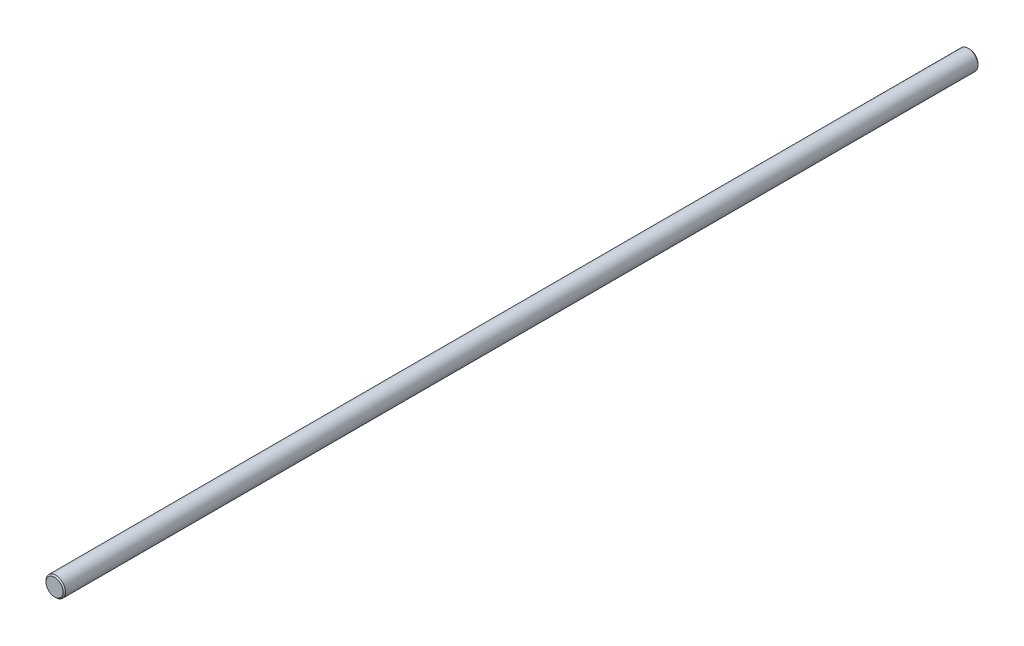
ISO-10303-21;
HEADER;
FILE_DESCRIPTION(('STEP AP214'),'2;1');
FILE_NAME('part.step','',(''),(''),'','','');
FILE_SCHEMA(('AUTOMOTIVE_DESIGN { 1 0 10303 214 1 1 1 1 }'));
ENDSEC;
DATA;
#1=APPLICATION_CONTEXT('core data for automotive mechanical design processes');
#2=APPLICATION_PROTOCOL_DEFINITION('international standard','automotive_design',2000,#1);
#3=PRODUCT_CONTEXT('',#1,'mechanical');
#4=PRODUCT('Part','Part','',(#3));
#5=PRODUCT_RELATED_PRODUCT_CATEGORY('part','',(#4));
#6=PRODUCT_DEFINITION_FORMATION('','',#4);
#7=PRODUCT_DEFINITION_CONTEXT('part definition',#1,'design');
#8=PRODUCT_DEFINITION('design','',#6,#7);
#9=PRODUCT_DEFINITION_SHAPE('','',#8);
#10=(LENGTH_UNIT() NAMED_UNIT(*) SI_UNIT(.MILLI.,.METRE.));
#11=(NAMED_UNIT(*) PLANE_ANGLE_UNIT() SI_UNIT($,.RADIAN.));
#12=(NAMED_UNIT(*) SI_UNIT($,.STERADIAN.) SOLID_ANGLE_UNIT());
#13=UNCERTAINTY_MEASURE_WITH_UNIT(LENGTH_MEASURE(1.E-05),#10,'distance_accuracy_value','');
#14=(GEOMETRIC_REPRESENTATION_CONTEXT(3) GLOBAL_UNCERTAINTY_ASSIGNED_CONTEXT((#13)) GLOBAL_UNIT_ASSIGNED_CONTEXT((#10,
#11,#12)) REPRESENTATION_CONTEXT('',''));
#15=CARTESIAN_POINT('',(0.,0.,0.));
#16=DIRECTION('',(0.,0.,1.));
#17=DIRECTION('',(1.,0.,0.));
#18=AXIS2_PLACEMENT_3D('',#15,#16,#17);
#19=CARTESIAN_POINT('',(0.,0.,375.));
#20=DIRECTION('',(0.,0.,-1.));
#21=DIRECTION('',(-1.,0.,0.));
#22=AXIS2_PLACEMENT_3D('',#19,#20,#21);
#23=CYLINDRICAL_SURFACE('',#22,4.);
#24=CARTESIAN_POINT('',(0.,0.,374.5));
#25=DIRECTION('',(0.,0.,1.));
#26=DIRECTION('',(1.,0.,0.));
#27=AXIS2_PLACEMENT_3D('',#24,#25,#26);
#28=CIRCLE('',#27,4.);
#29=CARTESIAN_POINT('',(4.,0.,374.5));
#30=VERTEX_POINT('',#29);
#31=EDGE_CURVE('E39',#30,#30,#28,.F.);
#32=ORIENTED_EDGE('',*,*,#31,.T.);
#33=EDGE_LOOP('',(#32));
#34=FACE_BOUND('',#33,.T.);
#35=CARTESIAN_POINT('',(0.,0.,0.500000000000111));
#36=DIRECTION('',(0.,0.,1.));
#37=DIRECTION('',(1.,0.,0.));
#38=AXIS2_PLACEMENT_3D('',#35,#36,#37);
#39=CIRCLE('',#38,4.);
#40=CARTESIAN_POINT('',(4.,0.,0.500000000000111));
#41=VERTEX_POINT('',#40);
#42=EDGE_CURVE('E43',#41,#41,#39,.T.);
#43=ORIENTED_EDGE('',*,*,#42,.T.);
#44=EDGE_LOOP('',(#43));
#45=FACE_BOUND('',#44,.T.);
#46=ADVANCED_FACE('F32',(#34,#45),#23,.T.);
#47=CARTESIAN_POINT('',(0.,0.,375.));
#48=DIRECTION('',(0.,0.,1.));
#49=DIRECTION('',(1.,0.,0.));
#50=AXIS2_PLACEMENT_3D('',#47,#48,#49);
#51=PLANE('',#50);
#52=CARTESIAN_POINT('',(0.,0.,375.));
#53=DIRECTION('',(0.,0.,1.));
#54=DIRECTION('',(1.,0.,0.));
#55=AXIS2_PLACEMENT_3D('',#52,#53,#54);
#56=CIRCLE('',#55,3.5);
#57=CARTESIAN_POINT('',(3.5,0.,375.));
#58=VERTEX_POINT('',#57);
#59=EDGE_CURVE('E47',#58,#58,#56,.T.);
#60=ORIENTED_EDGE('',*,*,#59,.T.);
#61=EDGE_LOOP('',(#60));
#62=FACE_BOUND('',#61,.T.);
#63=ADVANCED_FACE('F53',(#62),#51,.T.);
#64=CARTESIAN_POINT('',(0.,0.,0.));
#65=DIRECTION('',(0.,0.,1.));
#66=DIRECTION('',(1.,0.,0.));
#67=AXIS2_PLACEMENT_3D('',#64,#65,#66);
#68=PLANE('',#67);
#69=CARTESIAN_POINT('',(0.,0.,0.));
#70=DIRECTION('',(0.,0.,1.));
#71=DIRECTION('',(1.,0.,0.));
#72=AXIS2_PLACEMENT_3D('',#69,#70,#71);
#73=CIRCLE('',#72,3.49999999999989);
#74=CARTESIAN_POINT('',(3.49999999999989,0.,0.));
#75=VERTEX_POINT('',#74);
#76=EDGE_CURVE('E10',#75,#75,#73,.F.);
#77=ORIENTED_EDGE('',*,*,#76,.T.);
#78=EDGE_LOOP('',(#77));
#79=FACE_BOUND('',#78,.T.);
#80=ADVANCED_FACE('F57',(#79),#68,.F.);
#81=CARTESIAN_POINT('',(0.,0.,375.));
#82=DIRECTION('',(0.,0.,-1.));
#83=DIRECTION('',(-1.,0.,0.));
#84=AXIS2_PLACEMENT_3D('',#81,#82,#83);
#85=CONICAL_SURFACE('',#84,3.5,0.785398163397445);
#86=ORIENTED_EDGE('',*,*,#31,.F.);
#87=EDGE_LOOP('',(#86));
#88=FACE_BOUND('',#87,.T.);
#89=ORIENTED_EDGE('',*,*,#59,.F.);
#90=EDGE_LOOP('',(#89));
#91=FACE_BOUND('',#90,.T.);
#92=ADVANCED_FACE('F55',(#88,#91),#85,.T.);
#93=CARTESIAN_POINT('',(0.,0.,0.500000000000111));
#94=DIRECTION('',(0.,0.,1.));
#95=DIRECTION('',(1.,0.,0.));
#96=AXIS2_PLACEMENT_3D('',#93,#94,#95);
#97=CONICAL_SURFACE('',#96,4.,0.785398163397445);
#98=ORIENTED_EDGE('',*,*,#76,.F.);
#99=EDGE_LOOP('',(#98));
#100=FACE_BOUND('',#99,.T.);
#101=ORIENTED_EDGE('',*,*,#42,.F.);
#102=EDGE_LOOP('',(#101));
#103=FACE_BOUND('',#102,.T.);
#104=ADVANCED_FACE('F34',(#100,#103),#97,.T.);
#105=CLOSED_SHELL('',(#46,#63,#80,#92,#104));
#106=MANIFOLD_SOLID_BREP('B2',#105);
#107=ADVANCED_BREP_SHAPE_REPRESENTATION('',(#18,#106),#14);
#108=SHAPE_DEFINITION_REPRESENTATION(#9,#107);
ENDSEC;
END-ISO-10303-21;
